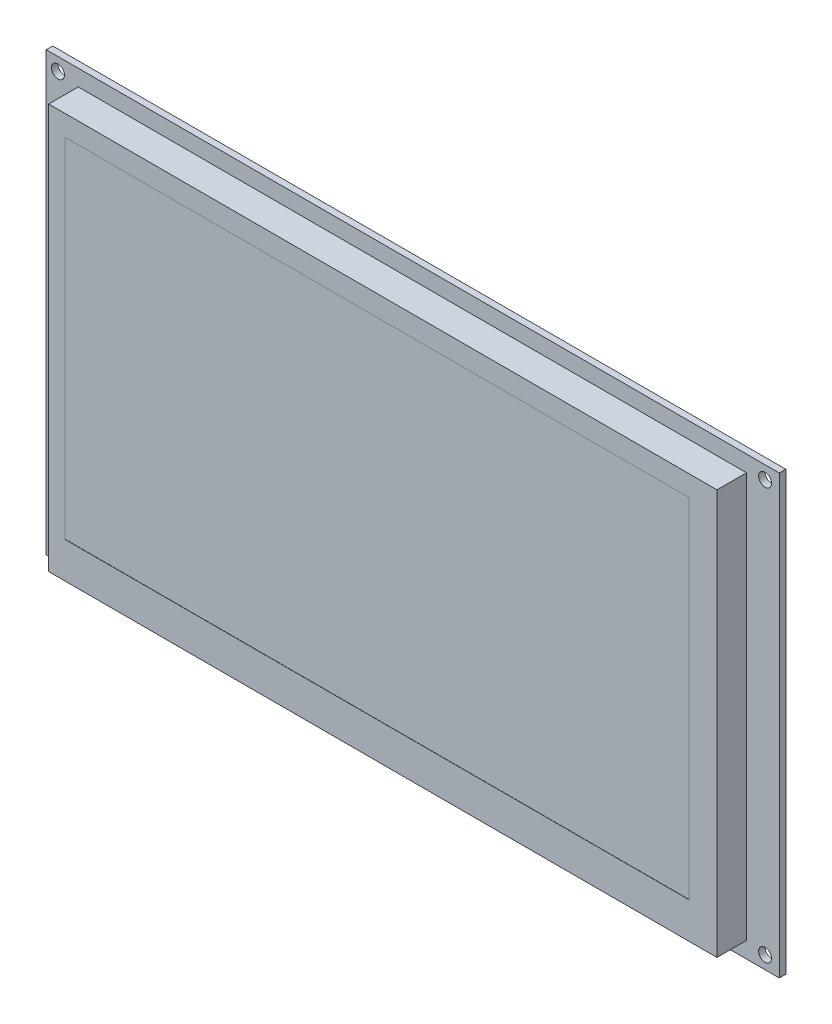
ISO-10303-21;
HEADER;
FILE_DESCRIPTION(('STEP AP214'),'2;1');
FILE_NAME('part.step','',(''),(''),'','','');
FILE_SCHEMA(('AUTOMOTIVE_DESIGN { 1 0 10303 214 1 1 1 1 }'));
ENDSEC;
DATA;
#1=APPLICATION_CONTEXT('core data for automotive mechanical design processes');
#2=APPLICATION_PROTOCOL_DEFINITION('international standard','automotive_design',2000,#1);
#3=PRODUCT_CONTEXT('',#1,'mechanical');
#4=PRODUCT('Part','Part','',(#3));
#5=PRODUCT_RELATED_PRODUCT_CATEGORY('part','',(#4));
#6=PRODUCT_DEFINITION_FORMATION('','',#4);
#7=PRODUCT_DEFINITION_CONTEXT('part definition',#1,'design');
#8=PRODUCT_DEFINITION('design','',#6,#7);
#9=PRODUCT_DEFINITION_SHAPE('','',#8);
#10=(LENGTH_UNIT() NAMED_UNIT(*) SI_UNIT(.MILLI.,.METRE.));
#11=(NAMED_UNIT(*) PLANE_ANGLE_UNIT() SI_UNIT($,.RADIAN.));
#12=(NAMED_UNIT(*) SI_UNIT($,.STERADIAN.) SOLID_ANGLE_UNIT());
#13=UNCERTAINTY_MEASURE_WITH_UNIT(LENGTH_MEASURE(1.E-05),#10,'distance_accuracy_value','');
#14=(GEOMETRIC_REPRESENTATION_CONTEXT(3) GLOBAL_UNCERTAINTY_ASSIGNED_CONTEXT((#13)) GLOBAL_UNIT_ASSIGNED_CONTEXT((#10,
#11,#12)) REPRESENTATION_CONTEXT('',''));
#15=CARTESIAN_POINT('',(0.,0.,0.));
#16=DIRECTION('',(0.,0.,1.));
#17=DIRECTION('',(1.,0.,0.));
#18=AXIS2_PLACEMENT_3D('',#15,#16,#17);
#19=CARTESIAN_POINT('',(-1.53999999999999,1.89999999999999,7.25));
#20=DIRECTION('',(0.,0.,-1.));
#21=DIRECTION('',(-1.,0.,0.));
#22=AXIS2_PLACEMENT_3D('',#19,#20,#21);
#23=PLANE('',#22);
#24=DIRECTION('',(0.,-1.,0.));
#25=VECTOR('',#24,1.);
#26=CARTESIAN_POINT('',(-78.59,-41.1,7.25));
#27=LINE('',#26,#25);
#28=CARTESIAN_POINT('',(-78.59,44.9,7.25));
#29=VERTEX_POINT('',#28);
#30=CARTESIAN_POINT('',(-78.59,-41.1,7.25));
#31=VERTEX_POINT('',#30);
#32=EDGE_CURVE('E108',#29,#31,#27,.T.);
#33=ORIENTED_EDGE('',*,*,#32,.T.);
#34=DIRECTION('',(1.,0.,0.));
#35=VECTOR('',#34,1.);
#36=CARTESIAN_POINT('',(75.51,-41.1,7.25));
#37=LINE('',#36,#35);
#38=CARTESIAN_POINT('',(75.51,-41.1,7.25));
#39=VERTEX_POINT('',#38);
#40=EDGE_CURVE('E222',#31,#39,#37,.T.);
#41=ORIENTED_EDGE('',*,*,#40,.T.);
#42=DIRECTION('',(0.,1.,0.));
#43=VECTOR('',#42,1.);
#44=CARTESIAN_POINT('',(75.51,44.9,7.25));
#45=LINE('',#44,#43);
#46=CARTESIAN_POINT('',(75.51,44.9,7.25));
#47=VERTEX_POINT('',#46);
#48=EDGE_CURVE('E104',#39,#47,#45,.T.);
#49=ORIENTED_EDGE('',*,*,#48,.T.);
#50=DIRECTION('',(1.,0.,0.));
#51=VECTOR('',#50,1.);
#52=CARTESIAN_POINT('',(-78.59,44.9,7.25));
#53=LINE('',#52,#51);
#54=EDGE_CURVE('E106',#47,#29,#53,.F.);
#55=ORIENTED_EDGE('',*,*,#54,.T.);
#56=EDGE_LOOP('',(#33,#41,#49,#55));
#57=FACE_BOUND('',#56,.T.);
#58=ADVANCED_FACE('F17',(#57),#23,.F.);
#59=CARTESIAN_POINT('',(-78.59,-41.1,7.3));
#60=DIRECTION('',(-1.,0.,0.));
#61=DIRECTION('',(0.,-1.,0.));
#62=AXIS2_PLACEMENT_3D('',#59,#60,#61);
#63=PLANE('',#62);
#64=DIRECTION('',(0.,0.,-1.));
#65=VECTOR('',#64,1.);
#66=CARTESIAN_POINT('',(-78.59,-41.1,7.3));
#67=LINE('',#66,#65);
#68=CARTESIAN_POINT('',(-78.59,-41.1,7.3));
#69=VERTEX_POINT('',#68);
#70=EDGE_CURVE('E119',#69,#31,#67,.T.);
#71=ORIENTED_EDGE('',*,*,#70,.T.);
#72=ORIENTED_EDGE('',*,*,#32,.F.);
#73=DIRECTION('',(0.,0.,1.));
#74=VECTOR('',#73,1.);
#75=CARTESIAN_POINT('',(-78.59,44.9,7.3));
#76=LINE('',#75,#74);
#77=CARTESIAN_POINT('',(-78.59,44.9,7.3));
#78=VERTEX_POINT('',#77);
#79=EDGE_CURVE('E113',#29,#78,#76,.T.);
#80=ORIENTED_EDGE('',*,*,#79,.T.);
#81=DIRECTION('',(0.,1.,0.));
#82=VECTOR('',#81,1.);
#83=CARTESIAN_POINT('',(-78.59,0.,7.3));
#84=LINE('',#83,#82);
#85=EDGE_CURVE('E218',#69,#78,#84,.T.);
#86=ORIENTED_EDGE('',*,*,#85,.F.);
#87=EDGE_LOOP('',(#71,#72,#80,#86));
#88=FACE_BOUND('',#87,.T.);
#89=ADVANCED_FACE('F116',(#88),#63,.F.);
#90=CARTESIAN_POINT('',(-78.59,44.9,7.3));
#91=DIRECTION('',(0.,1.,0.));
#92=DIRECTION('',(0.,0.,1.));
#93=AXIS2_PLACEMENT_3D('',#90,#91,#92);
#94=PLANE('',#93);
#95=ORIENTED_EDGE('',*,*,#79,.F.);
#96=ORIENTED_EDGE('',*,*,#54,.F.);
#97=DIRECTION('',(0.,0.,1.));
#98=VECTOR('',#97,1.);
#99=CARTESIAN_POINT('',(75.51,44.9,7.3));
#100=LINE('',#99,#98);
#101=CARTESIAN_POINT('',(75.51,44.9,7.3));
#102=VERTEX_POINT('',#101);
#103=EDGE_CURVE('E127',#47,#102,#100,.T.);
#104=ORIENTED_EDGE('',*,*,#103,.T.);
#105=DIRECTION('',(1.,0.,0.));
#106=VECTOR('',#105,1.);
#107=CARTESIAN_POINT('',(-0.0900000000000034,44.9,7.3));
#108=LINE('',#107,#106);
#109=EDGE_CURVE('E124',#78,#102,#108,.T.);
#110=ORIENTED_EDGE('',*,*,#109,.F.);
#111=EDGE_LOOP('',(#95,#96,#104,#110));
#112=FACE_BOUND('',#111,.T.);
#113=ADVANCED_FACE('F122',(#112),#94,.F.);
#114=CARTESIAN_POINT('',(75.51,44.9,7.3));
#115=DIRECTION('',(1.,0.,0.));
#116=DIRECTION('',(0.,1.,0.));
#117=AXIS2_PLACEMENT_3D('',#114,#115,#116);
#118=PLANE('',#117);
#119=ORIENTED_EDGE('',*,*,#103,.F.);
#120=ORIENTED_EDGE('',*,*,#48,.F.);
#121=DIRECTION('',(0.,0.,-1.));
#122=VECTOR('',#121,1.);
#123=CARTESIAN_POINT('',(75.51,-41.1,7.3));
#124=LINE('',#123,#122);
#125=CARTESIAN_POINT('',(75.51,-41.1,7.3));
#126=VERTEX_POINT('',#125);
#127=EDGE_CURVE('E220',#39,#126,#124,.F.);
#128=ORIENTED_EDGE('',*,*,#127,.T.);
#129=DIRECTION('',(0.,1.,0.));
#130=VECTOR('',#129,1.);
#131=CARTESIAN_POINT('',(75.51,0.,7.3));
#132=LINE('',#131,#130);
#133=EDGE_CURVE('E214',#102,#126,#132,.F.);
#134=ORIENTED_EDGE('',*,*,#133,.F.);
#135=EDGE_LOOP('',(#119,#120,#128,#134));
#136=FACE_BOUND('',#135,.T.);
#137=ADVANCED_FACE('F226',(#136),#118,.F.);
#138=CARTESIAN_POINT('',(75.51,-41.1,7.3));
#139=DIRECTION('',(0.,-1.,0.));
#140=DIRECTION('',(0.,0.,-1.));
#141=AXIS2_PLACEMENT_3D('',#138,#139,#140);
#142=PLANE('',#141);
#143=ORIENTED_EDGE('',*,*,#127,.F.);
#144=ORIENTED_EDGE('',*,*,#40,.F.);
#145=ORIENTED_EDGE('',*,*,#70,.F.);
#146=DIRECTION('',(1.,0.,0.));
#147=VECTOR('',#146,1.);
#148=CARTESIAN_POINT('',(-0.0900000000000034,-41.1,7.3));
#149=LINE('',#148,#147);
#150=EDGE_CURVE('E211',#126,#69,#149,.F.);
#151=ORIENTED_EDGE('',*,*,#150,.F.);
#152=EDGE_LOOP('',(#143,#144,#145,#151));
#153=FACE_BOUND('',#152,.T.);
#154=ADVANCED_FACE('F233',(#153),#142,.F.);
#155=CARTESIAN_POINT('',(-0.0900000000000034,0.,7.3));
#156=DIRECTION('',(0.,0.,1.));
#157=DIRECTION('',(1.,0.,0.));
#158=AXIS2_PLACEMENT_3D('',#155,#156,#157);
#159=PLANE('',#158);
#160=ORIENTED_EDGE('',*,*,#133,.T.);
#161=ORIENTED_EDGE('',*,*,#150,.T.);
#162=ORIENTED_EDGE('',*,*,#85,.T.);
#163=ORIENTED_EDGE('',*,*,#109,.T.);
#164=EDGE_LOOP('',(#160,#161,#162,#163));
#165=FACE_BOUND('',#164,.T.);
#166=DIRECTION('',(1.,0.,0.));
#167=VECTOR('',#166,1.);
#168=CARTESIAN_POINT('',(-82.59,-50.,7.3));
#169=LINE('',#168,#167);
#170=CARTESIAN_POINT('',(82.41,-50.,7.3));
#171=VERTEX_POINT('',#170);
#172=CARTESIAN_POINT('',(-82.59,-50.,7.3));
#173=VERTEX_POINT('',#172);
#174=EDGE_CURVE('E204',#171,#173,#169,.F.);
#175=ORIENTED_EDGE('',*,*,#174,.F.);
#176=DIRECTION('',(0.,1.,0.));
#177=VECTOR('',#176,1.);
#178=CARTESIAN_POINT('',(82.41,-50.,7.3));
#179=LINE('',#178,#177);
#180=CARTESIAN_POINT('',(82.41,50.,7.3));
#181=VERTEX_POINT('',#180);
#182=EDGE_CURVE('E209',#181,#171,#179,.F.);
#183=ORIENTED_EDGE('',*,*,#182,.F.);
#184=DIRECTION('',(1.,0.,0.));
#185=VECTOR('',#184,1.);
#186=CARTESIAN_POINT('',(82.41,50.,7.3));
#187=LINE('',#186,#185);
#188=CARTESIAN_POINT('',(-82.59,50.,7.3));
#189=VERTEX_POINT('',#188);
#190=EDGE_CURVE('E193',#189,#181,#187,.T.);
#191=ORIENTED_EDGE('',*,*,#190,.F.);
#192=DIRECTION('',(0.,-1.,0.));
#193=VECTOR('',#192,1.);
#194=CARTESIAN_POINT('',(-82.59,50.,7.3));
#195=LINE('',#194,#193);
#196=EDGE_CURVE('E199',#173,#189,#195,.F.);
#197=ORIENTED_EDGE('',*,*,#196,.F.);
#198=EDGE_LOOP('',(#175,#183,#191,#197));
#199=FACE_BOUND('',#198,.T.);
#200=ADVANCED_FACE('F230',(#165,#199),#159,.T.);
#201=CARTESIAN_POINT('',(82.41,-50.,0.));
#202=DIRECTION('',(1.,0.,0.));
#203=DIRECTION('',(0.,0.,-1.));
#204=AXIS2_PLACEMENT_3D('',#201,#202,#203);
#205=PLANE('',#204);
#206=ORIENTED_EDGE('',*,*,#182,.T.);
#207=DIRECTION('',(0.,0.,1.));
#208=VECTOR('',#207,1.);
#209=CARTESIAN_POINT('',(82.41,-50.,0.));
#210=LINE('',#209,#208);
#211=CARTESIAN_POINT('',(82.41,-50.,0.));
#212=VERTEX_POINT('',#211);
#213=EDGE_CURVE('E206',#212,#171,#210,.T.);
#214=ORIENTED_EDGE('',*,*,#213,.F.);
#215=DIRECTION('',(0.,1.,0.));
#216=VECTOR('',#215,1.);
#217=CARTESIAN_POINT('',(82.41,0.,0.));
#218=LINE('',#217,#216);
#219=CARTESIAN_POINT('',(82.41,50.,0.));
#220=VERTEX_POINT('',#219);
#221=EDGE_CURVE('E187',#220,#212,#218,.F.);
#222=ORIENTED_EDGE('',*,*,#221,.F.);
#223=DIRECTION('',(0.,0.,1.));
#224=VECTOR('',#223,1.);
#225=CARTESIAN_POINT('',(82.41,50.,0.));
#226=LINE('',#225,#224);
#227=EDGE_CURVE('E190',#181,#220,#226,.F.);
#228=ORIENTED_EDGE('',*,*,#227,.F.);
#229=EDGE_LOOP('',(#206,#214,#222,#228));
#230=FACE_BOUND('',#229,.T.);
#231=ADVANCED_FACE('F241',(#230),#205,.T.);
#232=CARTESIAN_POINT('',(-82.59,-50.,0.));
#233=DIRECTION('',(0.,-1.,0.));
#234=DIRECTION('',(1.,0.,0.));
#235=AXIS2_PLACEMENT_3D('',#232,#233,#234);
#236=PLANE('',#235);
#237=ORIENTED_EDGE('',*,*,#174,.T.);
#238=DIRECTION('',(0.,0.,1.));
#239=VECTOR('',#238,1.);
#240=CARTESIAN_POINT('',(-82.59,-50.,0.));
#241=LINE('',#240,#239);
#242=CARTESIAN_POINT('',(-82.59,-50.,0.));
#243=VERTEX_POINT('',#242);
#244=EDGE_CURVE('E201',#243,#173,#241,.T.);
#245=ORIENTED_EDGE('',*,*,#244,.F.);
#246=DIRECTION('',(1.,0.,0.));
#247=VECTOR('',#246,1.);
#248=CARTESIAN_POINT('',(0.,-50.,0.));
#249=LINE('',#248,#247);
#250=EDGE_CURVE('E184',#212,#243,#249,.F.);
#251=ORIENTED_EDGE('',*,*,#250,.F.);
#252=ORIENTED_EDGE('',*,*,#213,.T.);
#253=EDGE_LOOP('',(#237,#245,#251,#252));
#254=FACE_BOUND('',#253,.T.);
#255=ADVANCED_FACE('F293',(#254),#236,.T.);
#256=CARTESIAN_POINT('',(-82.59,50.,0.));
#257=DIRECTION('',(-1.,0.,0.));
#258=DIRECTION('',(0.,-1.,0.));
#259=AXIS2_PLACEMENT_3D('',#256,#257,#258);
#260=PLANE('',#259);
#261=ORIENTED_EDGE('',*,*,#196,.T.);
#262=DIRECTION('',(0.,0.,1.));
#263=VECTOR('',#262,1.);
#264=CARTESIAN_POINT('',(-82.59,50.,0.));
#265=LINE('',#264,#263);
#266=CARTESIAN_POINT('',(-82.59,50.,0.));
#267=VERTEX_POINT('',#266);
#268=EDGE_CURVE('E196',#267,#189,#265,.T.);
#269=ORIENTED_EDGE('',*,*,#268,.F.);
#270=DIRECTION('',(0.,1.,0.));
#271=VECTOR('',#270,1.);
#272=CARTESIAN_POINT('',(-82.59,0.,0.));
#273=LINE('',#272,#271);
#274=EDGE_CURVE('E181',#243,#267,#273,.T.);
#275=ORIENTED_EDGE('',*,*,#274,.F.);
#276=ORIENTED_EDGE('',*,*,#244,.T.);
#277=EDGE_LOOP('',(#261,#269,#275,#276));
#278=FACE_BOUND('',#277,.T.);
#279=ADVANCED_FACE('F289',(#278),#260,.T.);
#280=CARTESIAN_POINT('',(82.41,50.,0.));
#281=DIRECTION('',(0.,1.,0.));
#282=DIRECTION('',(0.,0.,1.));
#283=AXIS2_PLACEMENT_3D('',#280,#281,#282);
#284=PLANE('',#283);
#285=ORIENTED_EDGE('',*,*,#190,.T.);
#286=ORIENTED_EDGE('',*,*,#227,.T.);
#287=DIRECTION('',(1.,0.,0.));
#288=VECTOR('',#287,1.);
#289=CARTESIAN_POINT('',(0.,50.,0.));
#290=LINE('',#289,#288);
#291=EDGE_CURVE('E178',#267,#220,#290,.T.);
#292=ORIENTED_EDGE('',*,*,#291,.F.);
#293=ORIENTED_EDGE('',*,*,#268,.T.);
#294=EDGE_LOOP('',(#285,#286,#292,#293));
#295=FACE_BOUND('',#294,.T.);
#296=ADVANCED_FACE('F285',(#295),#284,.T.);
#297=CARTESIAN_POINT('',(0.,0.,0.));
#298=DIRECTION('',(0.,0.,1.));
#299=DIRECTION('',(1.,0.,0.));
#300=AXIS2_PLACEMENT_3D('',#297,#298,#299);
#301=PLANE('',#300);
#302=CARTESIAN_POINT('',(-87.6,50.8,0.));
#303=DIRECTION('',(0.,0.,-1.));
#304=DIRECTION('',(-1.,0.,0.));
#305=AXIS2_PLACEMENT_3D('',#302,#303,#304);
#306=CIRCLE('',#305,1.6);
#307=CARTESIAN_POINT('',(-89.2,50.8,0.));
#308=VERTEX_POINT('',#307);
#309=EDGE_CURVE('E140',#308,#308,#306,.T.);
#310=ORIENTED_EDGE('',*,*,#309,.T.);
#311=EDGE_LOOP('',(#310));
#312=FACE_BOUND('',#311,.T.);
#313=CARTESIAN_POINT('',(87.,50.8,0.));
#314=DIRECTION('',(0.,0.,-1.));
#315=DIRECTION('',(-1.,0.,0.));
#316=AXIS2_PLACEMENT_3D('',#313,#314,#315);
#317=CIRCLE('',#316,1.6);
#318=CARTESIAN_POINT('',(85.4,50.8,0.));
#319=VERTEX_POINT('',#318);
#320=EDGE_CURVE('E144',#319,#319,#317,.T.);
#321=ORIENTED_EDGE('',*,*,#320,.T.);
#322=EDGE_LOOP('',(#321));
#323=FACE_BOUND('',#322,.T.);
#324=CARTESIAN_POINT('',(87.,-50.8,0.));
#325=DIRECTION('',(0.,0.,-1.));
#326=DIRECTION('',(-1.,0.,0.));
#327=AXIS2_PLACEMENT_3D('',#324,#325,#326);
#328=CIRCLE('',#327,1.6);
#329=CARTESIAN_POINT('',(85.4,-50.8,0.));
#330=VERTEX_POINT('',#329);
#331=EDGE_CURVE('E146',#330,#330,#328,.T.);
#332=ORIENTED_EDGE('',*,*,#331,.T.);
#333=EDGE_LOOP('',(#332));
#334=FACE_BOUND('',#333,.T.);
#335=CARTESIAN_POINT('',(-87.6,-50.7999999999999,0.));
#336=DIRECTION('',(0.,0.,-1.));
#337=DIRECTION('',(-1.,0.,0.));
#338=AXIS2_PLACEMENT_3D('',#335,#336,#337);
#339=CIRCLE('',#338,1.6);
#340=CARTESIAN_POINT('',(-89.2,-50.7999999999999,0.));
#341=VERTEX_POINT('',#340);
#342=EDGE_CURVE('E20',#341,#341,#339,.T.);
#343=ORIENTED_EDGE('',*,*,#342,.T.);
#344=EDGE_LOOP('',(#343));
#345=FACE_BOUND('',#344,.T.);
#346=ORIENTED_EDGE('',*,*,#274,.T.);
#347=ORIENTED_EDGE('',*,*,#291,.T.);
#348=ORIENTED_EDGE('',*,*,#221,.T.);
#349=ORIENTED_EDGE('',*,*,#250,.T.);
#350=EDGE_LOOP('',(#346,#347,#348,#349));
#351=FACE_BOUND('',#350,.T.);
#352=DIRECTION('',(1.,0.,0.));
#353=VECTOR('',#352,1.);
#354=CARTESIAN_POINT('',(-90.5,54.,0.));
#355=LINE('',#354,#353);
#356=CARTESIAN_POINT('',(-90.5,54.,0.));
#357=VERTEX_POINT('',#356);
#358=CARTESIAN_POINT('',(90.5,54.,0.));
#359=VERTEX_POINT('',#358);
#360=EDGE_CURVE('E167',#357,#359,#355,.T.);
#361=ORIENTED_EDGE('',*,*,#360,.F.);
#362=DIRECTION('',(0.,1.,0.));
#363=VECTOR('',#362,1.);
#364=CARTESIAN_POINT('',(-90.5,-54.,0.));
#365=LINE('',#364,#363);
#366=CARTESIAN_POINT('',(-90.5,-54.,0.));
#367=VERTEX_POINT('',#366);
#368=EDGE_CURVE('E172',#367,#357,#365,.T.);
#369=ORIENTED_EDGE('',*,*,#368,.F.);
#370=DIRECTION('',(1.,0.,0.));
#371=VECTOR('',#370,1.);
#372=CARTESIAN_POINT('',(90.5,-54.,0.));
#373=LINE('',#372,#371);
#374=CARTESIAN_POINT('',(90.5,-54.,0.));
#375=VERTEX_POINT('',#374);
#376=EDGE_CURVE('E175',#375,#367,#373,.F.);
#377=ORIENTED_EDGE('',*,*,#376,.F.);
#378=DIRECTION('',(0.,1.,0.));
#379=VECTOR('',#378,1.);
#380=CARTESIAN_POINT('',(90.5,54.,0.));
#381=LINE('',#380,#379);
#382=EDGE_CURVE('E158',#359,#375,#381,.F.);
#383=ORIENTED_EDGE('',*,*,#382,.F.);
#384=EDGE_LOOP('',(#361,#369,#377,#383));
#385=FACE_BOUND('',#384,.T.);
#386=ADVANCED_FACE('F281',(#312,#323,#334,#345,#351,#385),#301,.T.);
#387=CARTESIAN_POINT('',(90.5,-54.,0.));
#388=DIRECTION('',(0.,-1.,0.));
#389=DIRECTION('',(0.,0.,-1.));
#390=AXIS2_PLACEMENT_3D('',#387,#388,#389);
#391=PLANE('',#390);
#392=DIRECTION('',(-1.,0.,0.));
#393=VECTOR('',#392,1.);
#394=CARTESIAN_POINT('',(0.,-54.,-1.6));
#395=LINE('',#394,#393);
#396=CARTESIAN_POINT('',(90.5,-54.,-1.6));
#397=VERTEX_POINT('',#396);
#398=CARTESIAN_POINT('',(-90.5,-54.,-1.6));
#399=VERTEX_POINT('',#398);
#400=EDGE_CURVE('E143',#397,#399,#395,.T.);
#401=ORIENTED_EDGE('',*,*,#400,.F.);
#402=DIRECTION('',(0.,0.,-1.));
#403=VECTOR('',#402,1.);
#404=CARTESIAN_POINT('',(90.5,-54.,0.));
#405=LINE('',#404,#403);
#406=EDGE_CURVE('E153',#375,#397,#405,.T.);
#407=ORIENTED_EDGE('',*,*,#406,.F.);
#408=ORIENTED_EDGE('',*,*,#376,.T.);
#409=DIRECTION('',(0.,0.,1.));
#410=VECTOR('',#409,1.);
#411=CARTESIAN_POINT('',(-90.5,-54.,0.));
#412=LINE('',#411,#410);
#413=EDGE_CURVE('E169',#399,#367,#412,.T.);
#414=ORIENTED_EDGE('',*,*,#413,.F.);
#415=EDGE_LOOP('',(#401,#407,#408,#414));
#416=FACE_BOUND('',#415,.T.);
#417=ADVANCED_FACE('F277',(#416),#391,.T.);
#418=CARTESIAN_POINT('',(-90.5,-54.,0.));
#419=DIRECTION('',(-1.,0.,0.));
#420=DIRECTION('',(0.,0.,1.));
#421=AXIS2_PLACEMENT_3D('',#418,#419,#420);
#422=PLANE('',#421);
#423=DIRECTION('',(0.,1.,0.));
#424=VECTOR('',#423,1.);
#425=CARTESIAN_POINT('',(-90.5,0.,-1.6));
#426=LINE('',#425,#424);
#427=CARTESIAN_POINT('',(-90.5,54.,-1.6));
#428=VERTEX_POINT('',#427);
#429=EDGE_CURVE('E317',#399,#428,#426,.T.);
#430=ORIENTED_EDGE('',*,*,#429,.F.);
#431=ORIENTED_EDGE('',*,*,#413,.T.);
#432=ORIENTED_EDGE('',*,*,#368,.T.);
#433=DIRECTION('',(0.,0.,1.));
#434=VECTOR('',#433,1.);
#435=CARTESIAN_POINT('',(-90.5,54.,0.));
#436=LINE('',#435,#434);
#437=EDGE_CURVE('E164',#428,#357,#436,.T.);
#438=ORIENTED_EDGE('',*,*,#437,.F.);
#439=EDGE_LOOP('',(#430,#431,#432,#438));
#440=FACE_BOUND('',#439,.T.);
#441=ADVANCED_FACE('F274',(#440),#422,.T.);
#442=CARTESIAN_POINT('',(-90.5,54.,0.));
#443=DIRECTION('',(0.,1.,0.));
#444=DIRECTION('',(0.,0.,1.));
#445=AXIS2_PLACEMENT_3D('',#442,#443,#444);
#446=PLANE('',#445);
#447=DIRECTION('',(-1.,0.,0.));
#448=VECTOR('',#447,1.);
#449=CARTESIAN_POINT('',(0.,54.,-1.6));
#450=LINE('',#449,#448);
#451=CARTESIAN_POINT('',(90.5,54.,-1.6));
#452=VERTEX_POINT('',#451);
#453=EDGE_CURVE('E313',#428,#452,#450,.F.);
#454=ORIENTED_EDGE('',*,*,#453,.F.);
#455=ORIENTED_EDGE('',*,*,#437,.T.);
#456=ORIENTED_EDGE('',*,*,#360,.T.);
#457=DIRECTION('',(0.,0.,-1.));
#458=VECTOR('',#457,1.);
#459=CARTESIAN_POINT('',(90.5,54.,0.));
#460=LINE('',#459,#458);
#461=EDGE_CURVE('E35',#452,#359,#460,.F.);
#462=ORIENTED_EDGE('',*,*,#461,.F.);
#463=EDGE_LOOP('',(#454,#455,#456,#462));
#464=FACE_BOUND('',#463,.T.);
#465=ADVANCED_FACE('F271',(#464),#446,.T.);
#466=CARTESIAN_POINT('',(90.5,54.,0.));
#467=DIRECTION('',(1.,0.,0.));
#468=DIRECTION('',(0.,0.,-1.));
#469=AXIS2_PLACEMENT_3D('',#466,#467,#468);
#470=PLANE('',#469);
#471=DIRECTION('',(0.,1.,0.));
#472=VECTOR('',#471,1.);
#473=CARTESIAN_POINT('',(90.5,0.,-1.6));
#474=LINE('',#473,#472);
#475=EDGE_CURVE('E139',#452,#397,#474,.F.);
#476=ORIENTED_EDGE('',*,*,#475,.F.);
#477=ORIENTED_EDGE('',*,*,#461,.T.);
#478=ORIENTED_EDGE('',*,*,#382,.T.);
#479=ORIENTED_EDGE('',*,*,#406,.T.);
#480=EDGE_LOOP('',(#476,#477,#478,#479));
#481=FACE_BOUND('',#480,.T.);
#482=ADVANCED_FACE('F267',(#481),#470,.T.);
#483=CARTESIAN_POINT('',(-87.6,-50.7999999999999,0.));
#484=DIRECTION('',(0.,0.,-1.));
#485=DIRECTION('',(-1.,0.,0.));
#486=AXIS2_PLACEMENT_3D('',#483,#484,#485);
#487=CYLINDRICAL_SURFACE('',#486,1.6);
#488=ORIENTED_EDGE('',*,*,#342,.F.);
#489=EDGE_LOOP('',(#488));
#490=FACE_BOUND('',#489,.T.);
#491=CARTESIAN_POINT('',(-87.6,-50.7999999999999,-1.6));
#492=DIRECTION('',(0.,0.,-1.));
#493=DIRECTION('',(-1.,0.,0.));
#494=AXIS2_PLACEMENT_3D('',#491,#492,#493);
#495=CIRCLE('',#494,1.6);
#496=CARTESIAN_POINT('',(-89.2,-50.7999999999999,-1.6));
#497=VERTEX_POINT('',#496);
#498=EDGE_CURVE('E136',#497,#497,#495,.F.);
#499=ORIENTED_EDGE('',*,*,#498,.F.);
#500=EDGE_LOOP('',(#499));
#501=FACE_BOUND('',#500,.T.);
#502=ADVANCED_FACE('F263',(#490,#501),#487,.F.);
#503=CARTESIAN_POINT('',(87.,-50.8,0.));
#504=DIRECTION('',(0.,0.,-1.));
#505=DIRECTION('',(-1.,0.,0.));
#506=AXIS2_PLACEMENT_3D('',#503,#504,#505);
#507=CYLINDRICAL_SURFACE('',#506,1.6);
#508=ORIENTED_EDGE('',*,*,#331,.F.);
#509=EDGE_LOOP('',(#508));
#510=FACE_BOUND('',#509,.T.);
#511=CARTESIAN_POINT('',(87.,-50.8,-1.6));
#512=DIRECTION('',(0.,0.,-1.));
#513=DIRECTION('',(-1.,0.,0.));
#514=AXIS2_PLACEMENT_3D('',#511,#512,#513);
#515=CIRCLE('',#514,1.6);
#516=CARTESIAN_POINT('',(85.4,-50.8,-1.6));
#517=VERTEX_POINT('',#516);
#518=EDGE_CURVE('E133',#517,#517,#515,.F.);
#519=ORIENTED_EDGE('',*,*,#518,.F.);
#520=EDGE_LOOP('',(#519));
#521=FACE_BOUND('',#520,.T.);
#522=ADVANCED_FACE('F259',(#510,#521),#507,.F.);
#523=CARTESIAN_POINT('',(87.,50.8,0.));
#524=DIRECTION('',(0.,0.,-1.));
#525=DIRECTION('',(-1.,0.,0.));
#526=AXIS2_PLACEMENT_3D('',#523,#524,#525);
#527=CYLINDRICAL_SURFACE('',#526,1.6);
#528=ORIENTED_EDGE('',*,*,#320,.F.);
#529=EDGE_LOOP('',(#528));
#530=FACE_BOUND('',#529,.T.);
#531=CARTESIAN_POINT('',(87.,50.8,-1.6));
#532=DIRECTION('',(0.,0.,-1.));
#533=DIRECTION('',(-1.,0.,0.));
#534=AXIS2_PLACEMENT_3D('',#531,#532,#533);
#535=CIRCLE('',#534,1.6);
#536=CARTESIAN_POINT('',(85.4,50.8,-1.6));
#537=VERTEX_POINT('',#536);
#538=EDGE_CURVE('E26',#537,#537,#535,.F.);
#539=ORIENTED_EDGE('',*,*,#538,.F.);
#540=EDGE_LOOP('',(#539));
#541=FACE_BOUND('',#540,.T.);
#542=ADVANCED_FACE('F252',(#530,#541),#527,.F.);
#543=CARTESIAN_POINT('',(-87.6,50.8,0.));
#544=DIRECTION('',(0.,0.,-1.));
#545=DIRECTION('',(-1.,0.,0.));
#546=AXIS2_PLACEMENT_3D('',#543,#544,#545);
#547=CYLINDRICAL_SURFACE('',#546,1.6);
#548=ORIENTED_EDGE('',*,*,#309,.F.);
#549=EDGE_LOOP('',(#548));
#550=FACE_BOUND('',#549,.T.);
#551=CARTESIAN_POINT('',(-87.6,50.8,-1.6));
#552=DIRECTION('',(0.,0.,-1.));
#553=DIRECTION('',(-1.,0.,0.));
#554=AXIS2_PLACEMENT_3D('',#551,#552,#553);
#555=CIRCLE('',#554,1.6);
#556=CARTESIAN_POINT('',(-89.2,50.8,-1.6));
#557=VERTEX_POINT('',#556);
#558=EDGE_CURVE('E11',#557,#557,#555,.F.);
#559=ORIENTED_EDGE('',*,*,#558,.F.);
#560=EDGE_LOOP('',(#559));
#561=FACE_BOUND('',#560,.T.);
#562=ADVANCED_FACE('F246',(#550,#561),#547,.F.);
#563=CARTESIAN_POINT('',(0.,0.,-1.6));
#564=DIRECTION('',(0.,0.,-1.));
#565=DIRECTION('',(-1.,0.,0.));
#566=AXIS2_PLACEMENT_3D('',#563,#564,#565);
#567=PLANE('',#566);
#568=ORIENTED_EDGE('',*,*,#558,.T.);
#569=EDGE_LOOP('',(#568));
#570=FACE_BOUND('',#569,.T.);
#571=ORIENTED_EDGE('',*,*,#538,.T.);
#572=EDGE_LOOP('',(#571));
#573=FACE_BOUND('',#572,.T.);
#574=ORIENTED_EDGE('',*,*,#518,.T.);
#575=EDGE_LOOP('',(#574));
#576=FACE_BOUND('',#575,.T.);
#577=ORIENTED_EDGE('',*,*,#498,.T.);
#578=EDGE_LOOP('',(#577));
#579=FACE_BOUND('',#578,.T.);
#580=ORIENTED_EDGE('',*,*,#453,.T.);
#581=ORIENTED_EDGE('',*,*,#475,.T.);
#582=ORIENTED_EDGE('',*,*,#400,.T.);
#583=ORIENTED_EDGE('',*,*,#429,.T.);
#584=EDGE_LOOP('',(#580,#581,#582,#583));
#585=FACE_BOUND('',#584,.T.);
#586=ADVANCED_FACE('F244',(#570,#573,#576,#579,#585),#567,.T.);
#587=CLOSED_SHELL('',(#58,#89,#113,#137,#154,#200,#231,#255,#279,#296,#386,#417,#441,#465,#482,
#502,#522,#542,#562,#586));
#588=MANIFOLD_SOLID_BREP('B1',#587);
#589=ADVANCED_BREP_SHAPE_REPRESENTATION('',(#18,#588),#14);
#590=SHAPE_DEFINITION_REPRESENTATION(#9,#589);
ENDSEC;
END-ISO-10303-21;
